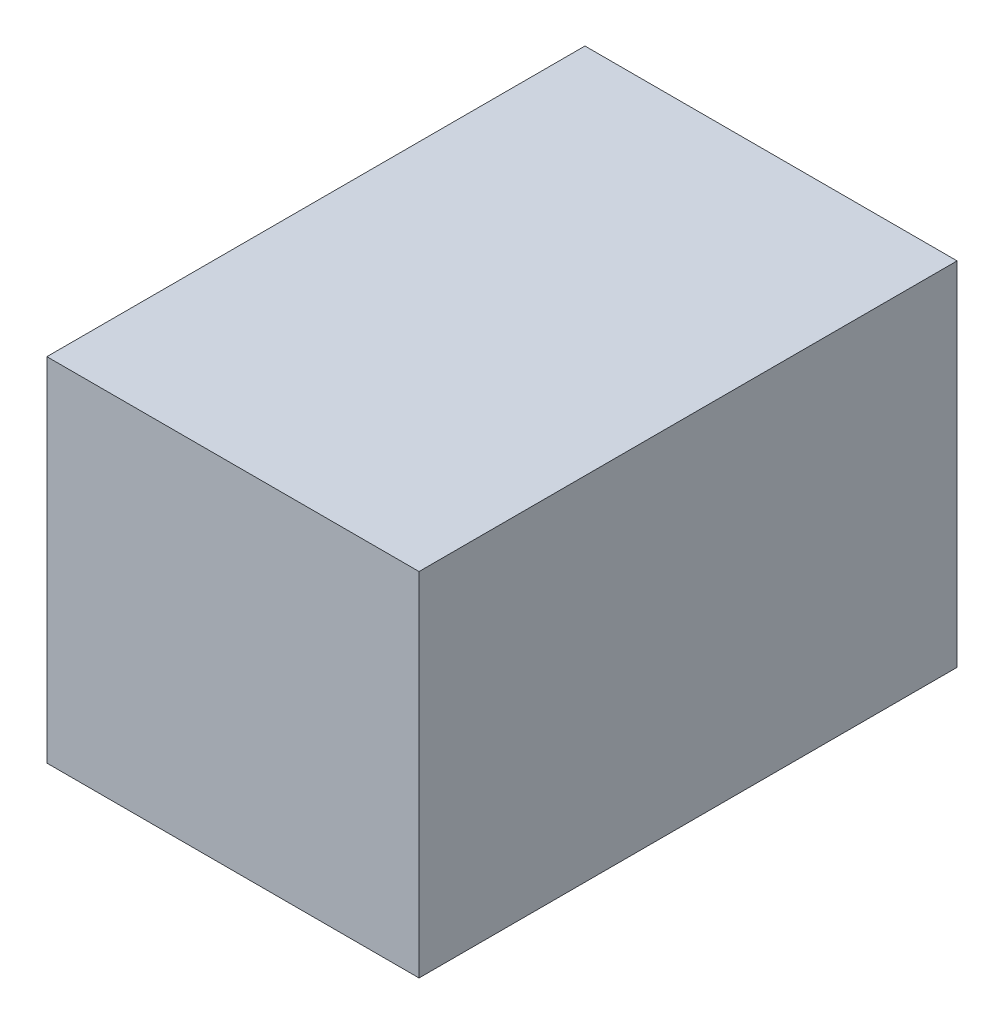
ISO-10303-21;
HEADER;
FILE_DESCRIPTION(('STEP AP214'),'2;1');
FILE_NAME('part.step','',(''),(''),'','','');
FILE_SCHEMA(('AUTOMOTIVE_DESIGN { 1 0 10303 214 1 1 1 1 }'));
ENDSEC;
DATA;
#1=APPLICATION_CONTEXT('core data for automotive mechanical design processes');
#2=APPLICATION_PROTOCOL_DEFINITION('international standard','automotive_design',2000,#1);
#3=PRODUCT_CONTEXT('',#1,'mechanical');
#4=PRODUCT('Part','Part','',(#3));
#5=PRODUCT_RELATED_PRODUCT_CATEGORY('part','',(#4));
#6=PRODUCT_DEFINITION_FORMATION('','',#4);
#7=PRODUCT_DEFINITION_CONTEXT('part definition',#1,'design');
#8=PRODUCT_DEFINITION('design','',#6,#7);
#9=PRODUCT_DEFINITION_SHAPE('','',#8);
#10=(LENGTH_UNIT() NAMED_UNIT(*) SI_UNIT(.MILLI.,.METRE.));
#11=(NAMED_UNIT(*) PLANE_ANGLE_UNIT() SI_UNIT($,.RADIAN.));
#12=(NAMED_UNIT(*) SI_UNIT($,.STERADIAN.) SOLID_ANGLE_UNIT());
#13=UNCERTAINTY_MEASURE_WITH_UNIT(LENGTH_MEASURE(1.E-05),#10,'distance_accuracy_value','');
#14=(GEOMETRIC_REPRESENTATION_CONTEXT(3) GLOBAL_UNCERTAINTY_ASSIGNED_CONTEXT((#13)) GLOBAL_UNIT_ASSIGNED_CONTEXT((#10,
#11,#12)) REPRESENTATION_CONTEXT('',''));
#15=CARTESIAN_POINT('',(0.,0.,0.));
#16=DIRECTION('',(0.,0.,1.));
#17=DIRECTION('',(1.,0.,0.));
#18=AXIS2_PLACEMENT_3D('',#15,#16,#17);
#19=CARTESIAN_POINT('',(0.,0.315,0.));
#20=DIRECTION('',(0.,1.,0.));
#21=DIRECTION('',(1.,0.,0.));
#22=AXIS2_PLACEMENT_3D('',#19,#20,#21);
#23=PLANE('',#22);
#24=DIRECTION('',(0.,0.,1.));
#25=VECTOR('',#24,1.);
#26=CARTESIAN_POINT('',(0.110734624208,0.315,0.22324387803));
#27=LINE('',#26,#25);
#28=CARTESIAN_POINT('',(0.110734624208,0.315,0.22324387803));
#29=VERTEX_POINT('',#28);
#30=CARTESIAN_POINT('',(0.110734624208,0.315,0.376095727583));
#31=VERTEX_POINT('',#30);
#32=EDGE_CURVE('E95',#29,#31,#27,.T.);
#33=ORIENTED_EDGE('',*,*,#32,.F.);
#34=DIRECTION('',(-1.,0.,0.));
#35=VECTOR('',#34,1.);
#36=CARTESIAN_POINT('',(0.110734624208,0.315,0.22324387803));
#37=LINE('',#36,#35);
#38=CARTESIAN_POINT('',(0.216457153481,0.315,0.22324387803));
#39=VERTEX_POINT('',#38);
#40=EDGE_CURVE('E21',#39,#29,#37,.T.);
#41=ORIENTED_EDGE('',*,*,#40,.F.);
#42=DIRECTION('',(0.,0.,-1.));
#43=VECTOR('',#42,1.);
#44=CARTESIAN_POINT('',(0.216457153481,0.315,0.22324387803));
#45=LINE('',#44,#43);
#46=CARTESIAN_POINT('',(0.216457153481,0.315,0.376095727583));
#47=VERTEX_POINT('',#46);
#48=EDGE_CURVE('E86',#47,#39,#45,.T.);
#49=ORIENTED_EDGE('',*,*,#48,.F.);
#50=DIRECTION('',(1.,0.,0.));
#51=VECTOR('',#50,1.);
#52=CARTESIAN_POINT('',(0.110734624208,0.315,0.376095727583));
#53=LINE('',#52,#51);
#54=EDGE_CURVE('E68',#31,#47,#53,.T.);
#55=ORIENTED_EDGE('',*,*,#54,.F.);
#56=EDGE_LOOP('',(#33,#41,#49,#55));
#57=FACE_BOUND('',#56,.T.);
#58=ADVANCED_FACE('F17',(#57),#23,.F.);
#59=CARTESIAN_POINT('',(0.,0.415,0.));
#60=DIRECTION('',(0.,1.,0.));
#61=DIRECTION('',(1.,0.,0.));
#62=AXIS2_PLACEMENT_3D('',#59,#60,#61);
#63=PLANE('',#62);
#64=DIRECTION('',(0.,0.,1.));
#65=VECTOR('',#64,1.);
#66=CARTESIAN_POINT('',(0.110734624208,0.415,0.22324387803));
#67=LINE('',#66,#65);
#68=CARTESIAN_POINT('',(0.110734624208,0.415,0.22324387803));
#69=VERTEX_POINT('',#68);
#70=CARTESIAN_POINT('',(0.110734624208,0.415,0.376095727583));
#71=VERTEX_POINT('',#70);
#72=EDGE_CURVE('E89',#69,#71,#67,.T.);
#73=ORIENTED_EDGE('',*,*,#72,.T.);
#74=DIRECTION('',(1.,0.,0.));
#75=VECTOR('',#74,1.);
#76=CARTESIAN_POINT('',(0.110734624208,0.415,0.376095727583));
#77=LINE('',#76,#75);
#78=CARTESIAN_POINT('',(0.216457153481,0.415,0.376095727583));
#79=VERTEX_POINT('',#78);
#80=EDGE_CURVE('E76',#71,#79,#77,.T.);
#81=ORIENTED_EDGE('',*,*,#80,.T.);
#82=DIRECTION('',(0.,0.,-1.));
#83=VECTOR('',#82,1.);
#84=CARTESIAN_POINT('',(0.216457153481,0.415,0.22324387803));
#85=LINE('',#84,#83);
#86=CARTESIAN_POINT('',(0.216457153481,0.415,0.22324387803));
#87=VERTEX_POINT('',#86);
#88=EDGE_CURVE('E112',#79,#87,#85,.T.);
#89=ORIENTED_EDGE('',*,*,#88,.T.);
#90=DIRECTION('',(-1.,0.,0.));
#91=VECTOR('',#90,1.);
#92=CARTESIAN_POINT('',(0.110734624208,0.415,0.22324387803));
#93=LINE('',#92,#91);
#94=EDGE_CURVE('E11',#87,#69,#93,.T.);
#95=ORIENTED_EDGE('',*,*,#94,.T.);
#96=EDGE_LOOP('',(#73,#81,#89,#95));
#97=FACE_BOUND('',#96,.T.);
#98=ADVANCED_FACE('F19',(#97),#63,.T.);
#99=CARTESIAN_POINT('',(0.110734624208,0.415,0.22324387803));
#100=DIRECTION('',(0.,0.,1.));
#101=DIRECTION('',(1.,0.,0.));
#102=AXIS2_PLACEMENT_3D('',#99,#100,#101);
#103=PLANE('',#102);
#104=ORIENTED_EDGE('',*,*,#40,.T.);
#105=DIRECTION('',(0.,-1.,0.));
#106=VECTOR('',#105,1.);
#107=CARTESIAN_POINT('',(0.110734624208,0.415,0.22324387803));
#108=LINE('',#107,#106);
#109=EDGE_CURVE('E92',#69,#29,#108,.T.);
#110=ORIENTED_EDGE('',*,*,#109,.F.);
#111=ORIENTED_EDGE('',*,*,#94,.F.);
#112=DIRECTION('',(0.,-1.,0.));
#113=VECTOR('',#112,1.);
#114=CARTESIAN_POINT('',(0.216457153481,0.415,0.22324387803));
#115=LINE('',#114,#113);
#116=EDGE_CURVE('E106',#87,#39,#115,.T.);
#117=ORIENTED_EDGE('',*,*,#116,.T.);
#118=EDGE_LOOP('',(#104,#110,#111,#117));
#119=FACE_BOUND('',#118,.T.);
#120=ADVANCED_FACE('F140',(#119),#103,.F.);
#121=CARTESIAN_POINT('',(0.216457153481,0.415,0.22324387803));
#122=DIRECTION('',(-1.,0.,0.));
#123=DIRECTION('',(0.,0.,1.));
#124=AXIS2_PLACEMENT_3D('',#121,#122,#123);
#125=PLANE('',#124);
#126=ORIENTED_EDGE('',*,*,#48,.T.);
#127=ORIENTED_EDGE('',*,*,#116,.F.);
#128=ORIENTED_EDGE('',*,*,#88,.F.);
#129=DIRECTION('',(0.,-1.,0.));
#130=VECTOR('',#129,1.);
#131=CARTESIAN_POINT('',(0.216457153481,0.415,0.376095727583));
#132=LINE('',#131,#130);
#133=EDGE_CURVE('E83',#79,#47,#132,.T.);
#134=ORIENTED_EDGE('',*,*,#133,.T.);
#135=EDGE_LOOP('',(#126,#127,#128,#134));
#136=FACE_BOUND('',#135,.T.);
#137=ADVANCED_FACE('F144',(#136),#125,.F.);
#138=CARTESIAN_POINT('',(0.110734624208,0.415,0.376095727583));
#139=DIRECTION('',(0.,0.,-1.));
#140=DIRECTION('',(0.,-1.,0.));
#141=AXIS2_PLACEMENT_3D('',#138,#139,#140);
#142=PLANE('',#141);
#143=ORIENTED_EDGE('',*,*,#54,.T.);
#144=ORIENTED_EDGE('',*,*,#133,.F.);
#145=ORIENTED_EDGE('',*,*,#80,.F.);
#146=DIRECTION('',(0.,-1.,0.));
#147=VECTOR('',#146,1.);
#148=CARTESIAN_POINT('',(0.110734624208,0.415,0.376095727583));
#149=LINE('',#148,#147);
#150=EDGE_CURVE('E80',#71,#31,#149,.T.);
#151=ORIENTED_EDGE('',*,*,#150,.T.);
#152=EDGE_LOOP('',(#143,#144,#145,#151));
#153=FACE_BOUND('',#152,.T.);
#154=ADVANCED_FACE('F78',(#153),#142,.F.);
#155=CARTESIAN_POINT('',(0.110734624208,0.415,0.22324387803));
#156=DIRECTION('',(1.,0.,0.));
#157=DIRECTION('',(0.,1.,0.));
#158=AXIS2_PLACEMENT_3D('',#155,#156,#157);
#159=PLANE('',#158);
#160=ORIENTED_EDGE('',*,*,#32,.T.);
#161=ORIENTED_EDGE('',*,*,#150,.F.);
#162=ORIENTED_EDGE('',*,*,#72,.F.);
#163=ORIENTED_EDGE('',*,*,#109,.T.);
#164=EDGE_LOOP('',(#160,#161,#162,#163));
#165=FACE_BOUND('',#164,.T.);
#166=ADVANCED_FACE('F94',(#165),#159,.F.);
#167=CLOSED_SHELL('',(#58,#98,#120,#137,#154,#166));
#168=MANIFOLD_SOLID_BREP('B1',#167);
#169=ADVANCED_BREP_SHAPE_REPRESENTATION('',(#18,#168),#14);
#170=SHAPE_DEFINITION_REPRESENTATION(#9,#169);
ENDSEC;
END-ISO-10303-21;
